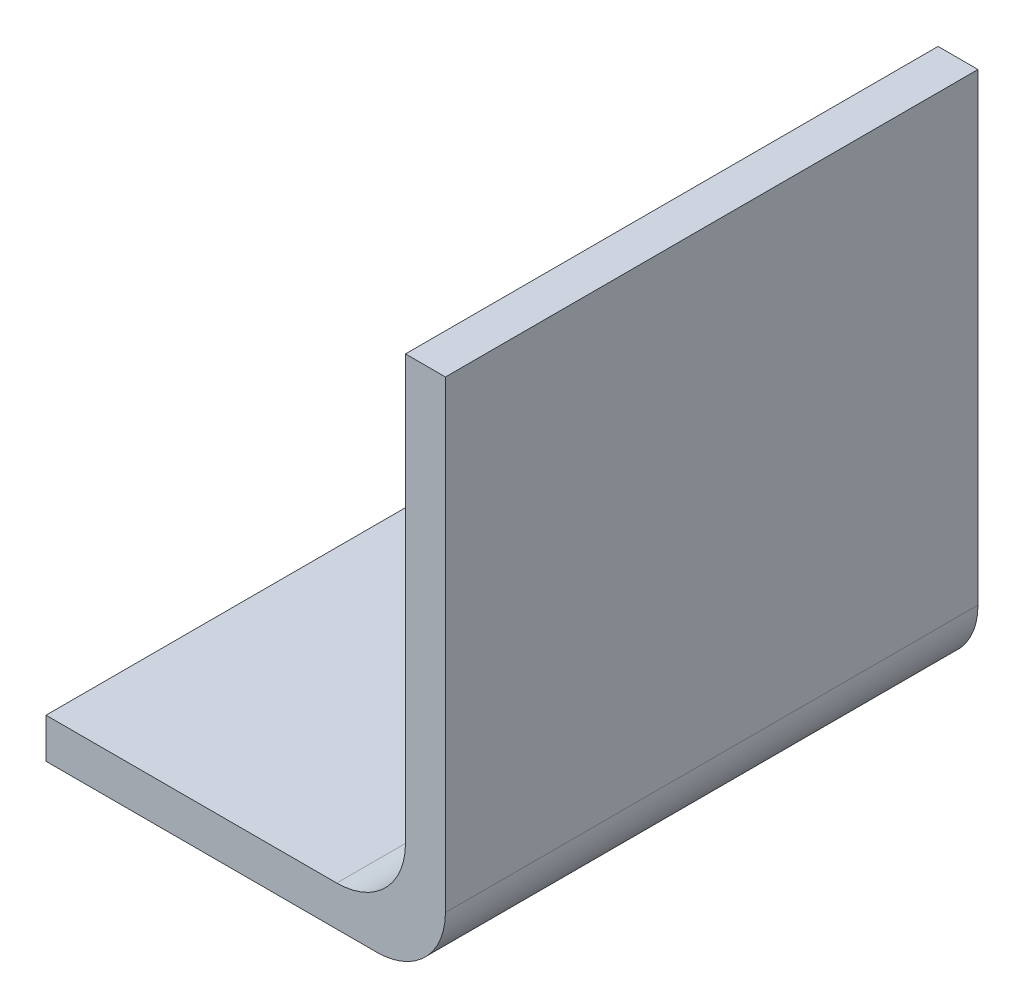
ISO-10303-21;
HEADER;
FILE_DESCRIPTION(('STEP AP214'),'2;1');
FILE_NAME('part.step','',(''),(''),'','','');
FILE_SCHEMA(('AUTOMOTIVE_DESIGN { 1 0 10303 214 1 1 1 1 }'));
ENDSEC;
DATA;
#1=APPLICATION_CONTEXT('core data for automotive mechanical design processes');
#2=APPLICATION_PROTOCOL_DEFINITION('international standard','automotive_design',2000,#1);
#3=PRODUCT_CONTEXT('',#1,'mechanical');
#4=PRODUCT('Part','Part','',(#3));
#5=PRODUCT_RELATED_PRODUCT_CATEGORY('part','',(#4));
#6=PRODUCT_DEFINITION_FORMATION('','',#4);
#7=PRODUCT_DEFINITION_CONTEXT('part definition',#1,'design');
#8=PRODUCT_DEFINITION('design','',#6,#7);
#9=PRODUCT_DEFINITION_SHAPE('','',#8);
#10=(LENGTH_UNIT() NAMED_UNIT(*) SI_UNIT(.MILLI.,.METRE.));
#11=(NAMED_UNIT(*) PLANE_ANGLE_UNIT() SI_UNIT($,.RADIAN.));
#12=(NAMED_UNIT(*) SI_UNIT($,.STERADIAN.) SOLID_ANGLE_UNIT());
#13=UNCERTAINTY_MEASURE_WITH_UNIT(LENGTH_MEASURE(1.E-05),#10,'distance_accuracy_value','');
#14=(GEOMETRIC_REPRESENTATION_CONTEXT(3) GLOBAL_UNCERTAINTY_ASSIGNED_CONTEXT((#13)) GLOBAL_UNIT_ASSIGNED_CONTEXT((#10,
#11,#12)) REPRESENTATION_CONTEXT('',''));
#15=CARTESIAN_POINT('',(0.,0.,0.));
#16=DIRECTION('',(0.,0.,1.));
#17=DIRECTION('',(1.,0.,0.));
#18=AXIS2_PLACEMENT_3D('',#15,#16,#17);
#19=CARTESIAN_POINT('',(0.,3.,40.));
#20=DIRECTION('',(1.,0.,0.));
#21=DIRECTION('',(0.,1.,0.));
#22=AXIS2_PLACEMENT_3D('',#19,#20,#21);
#23=PLANE('',#22);
#24=DIRECTION('',(0.,-1.,0.));
#25=VECTOR('',#24,1.);
#26=CARTESIAN_POINT('',(0.,3.,0.));
#27=LINE('',#26,#25);
#28=CARTESIAN_POINT('',(0.,3.,0.));
#29=VERTEX_POINT('',#28);
#30=CARTESIAN_POINT('',(0.,0.,0.));
#31=VERTEX_POINT('',#30);
#32=EDGE_CURVE('E131',#29,#31,#27,.T.);
#33=ORIENTED_EDGE('',*,*,#32,.T.);
#34=DIRECTION('',(0.,0.,-1.));
#35=VECTOR('',#34,1.);
#36=CARTESIAN_POINT('',(0.,0.,40.));
#37=LINE('',#36,#35);
#38=CARTESIAN_POINT('',(0.,0.,40.));
#39=VERTEX_POINT('',#38);
#40=EDGE_CURVE('E11',#39,#31,#37,.T.);
#41=ORIENTED_EDGE('',*,*,#40,.F.);
#42=DIRECTION('',(0.,-1.,0.));
#43=VECTOR('',#42,1.);
#44=CARTESIAN_POINT('',(0.,3.,40.));
#45=LINE('',#44,#43);
#46=CARTESIAN_POINT('',(0.,3.,40.));
#47=VERTEX_POINT('',#46);
#48=EDGE_CURVE('E146',#47,#39,#45,.T.);
#49=ORIENTED_EDGE('',*,*,#48,.F.);
#50=DIRECTION('',(0.,0.,-1.));
#51=VECTOR('',#50,1.);
#52=CARTESIAN_POINT('',(0.,3.,40.));
#53=LINE('',#52,#51);
#54=EDGE_CURVE('E127',#47,#29,#53,.T.);
#55=ORIENTED_EDGE('',*,*,#54,.T.);
#56=EDGE_LOOP('',(#33,#41,#49,#55));
#57=FACE_BOUND('',#56,.T.);
#58=ADVANCED_FACE('F35',(#57),#23,.F.);
#59=CARTESIAN_POINT('',(0.,0.,40.));
#60=DIRECTION('',(0.,1.,0.));
#61=DIRECTION('',(0.,0.,1.));
#62=AXIS2_PLACEMENT_3D('',#59,#60,#61);
#63=PLANE('',#62);
#64=CARTESIAN_POINT('',(14.7097260011682,0.,20.));
#65=DIRECTION('',(0.,1.,0.));
#66=DIRECTION('',(0.,0.,1.));
#67=AXIS2_PLACEMENT_3D('',#64,#65,#66);
#68=CIRCLE('',#67,5.);
#69=CARTESIAN_POINT('',(14.7097260011682,0.,25.));
#70=VERTEX_POINT('',#69);
#71=EDGE_CURVE('E135',#70,#70,#68,.T.);
#72=ORIENTED_EDGE('',*,*,#71,.T.);
#73=EDGE_LOOP('',(#72));
#74=FACE_BOUND('',#73,.T.);
#75=DIRECTION('',(1.,0.,0.));
#76=VECTOR('',#75,1.);
#77=CARTESIAN_POINT('',(0.,0.,0.));
#78=LINE('',#77,#76);
#79=CARTESIAN_POINT('',(24.8368515756481,0.,0.));
#80=VERTEX_POINT('',#79);
#81=EDGE_CURVE('E134',#31,#80,#78,.T.);
#82=ORIENTED_EDGE('',*,*,#81,.T.);
#83=DIRECTION('',(0.,0.,-1.));
#84=VECTOR('',#83,1.);
#85=CARTESIAN_POINT('',(24.8368515756481,0.,40.));
#86=LINE('',#85,#84);
#87=CARTESIAN_POINT('',(24.8368515756481,0.,40.));
#88=VERTEX_POINT('',#87);
#89=EDGE_CURVE('E43',#88,#80,#86,.T.);
#90=ORIENTED_EDGE('',*,*,#89,.F.);
#91=DIRECTION('',(1.,0.,0.));
#92=VECTOR('',#91,1.);
#93=CARTESIAN_POINT('',(0.,0.,40.));
#94=LINE('',#93,#92);
#95=EDGE_CURVE('E94',#39,#88,#94,.T.);
#96=ORIENTED_EDGE('',*,*,#95,.F.);
#97=ORIENTED_EDGE('',*,*,#40,.T.);
#98=EDGE_LOOP('',(#82,#90,#96,#97));
#99=FACE_BOUND('',#98,.T.);
#100=ADVANCED_FACE('F199',(#74,#99),#63,.F.);
#101=CARTESIAN_POINT('',(24.8368515756481,5.16314842435189,40.));
#102=DIRECTION('',(0.,0.,-1.));
#103=DIRECTION('',(-1.,0.,0.));
#104=AXIS2_PLACEMENT_3D('',#101,#102,#103);
#105=CYLINDRICAL_SURFACE('',#104,5.16314842435189);
#106=CARTESIAN_POINT('',(24.8368515756481,5.16314842435189,0.));
#107=DIRECTION('',(0.,0.,1.));
#108=DIRECTION('',(1.,0.,0.));
#109=AXIS2_PLACEMENT_3D('',#106,#107,#108);
#110=CIRCLE('',#109,5.16314842435189);
#111=CARTESIAN_POINT('',(30.,5.16314842435189,0.));
#112=VERTEX_POINT('',#111);
#113=EDGE_CURVE('E137',#80,#112,#110,.T.);
#114=ORIENTED_EDGE('',*,*,#113,.T.);
#115=DIRECTION('',(0.,0.,-1.));
#116=VECTOR('',#115,1.);
#117=CARTESIAN_POINT('',(30.,5.16314842435189,40.));
#118=LINE('',#117,#116);
#119=CARTESIAN_POINT('',(30.,5.16314842435189,40.));
#120=VERTEX_POINT('',#119);
#121=EDGE_CURVE('E153',#120,#112,#118,.T.);
#122=ORIENTED_EDGE('',*,*,#121,.F.);
#123=CARTESIAN_POINT('',(24.8368515756481,5.16314842435189,40.));
#124=DIRECTION('',(0.,0.,1.));
#125=DIRECTION('',(1.,0.,0.));
#126=AXIS2_PLACEMENT_3D('',#123,#124,#125);
#127=CIRCLE('',#126,5.16314842435189);
#128=EDGE_CURVE('E161',#88,#120,#127,.T.);
#129=ORIENTED_EDGE('',*,*,#128,.F.);
#130=ORIENTED_EDGE('',*,*,#89,.T.);
#131=EDGE_LOOP('',(#114,#122,#129,#130));
#132=FACE_BOUND('',#131,.T.);
#133=ADVANCED_FACE('F159',(#132),#105,.T.);
#134=CARTESIAN_POINT('',(30.,5.16314842435189,40.));
#135=DIRECTION('',(-1.,0.,0.));
#136=DIRECTION('',(0.,0.,1.));
#137=AXIS2_PLACEMENT_3D('',#134,#135,#136);
#138=PLANE('',#137);
#139=DIRECTION('',(0.,1.,0.));
#140=VECTOR('',#139,1.);
#141=CARTESIAN_POINT('',(30.,5.16314842435189,0.));
#142=LINE('',#141,#140);
#143=CARTESIAN_POINT('',(30.,40.,0.));
#144=VERTEX_POINT('',#143);
#145=EDGE_CURVE('E139',#112,#144,#142,.T.);
#146=ORIENTED_EDGE('',*,*,#145,.T.);
#147=DIRECTION('',(0.,0.,-1.));
#148=VECTOR('',#147,1.);
#149=CARTESIAN_POINT('',(30.,40.,40.));
#150=LINE('',#149,#148);
#151=CARTESIAN_POINT('',(30.,40.,40.));
#152=VERTEX_POINT('',#151);
#153=EDGE_CURVE('E150',#152,#144,#150,.T.);
#154=ORIENTED_EDGE('',*,*,#153,.F.);
#155=DIRECTION('',(0.,1.,0.));
#156=VECTOR('',#155,1.);
#157=CARTESIAN_POINT('',(30.,5.16314842435189,40.));
#158=LINE('',#157,#156);
#159=EDGE_CURVE('E173',#120,#152,#158,.T.);
#160=ORIENTED_EDGE('',*,*,#159,.F.);
#161=ORIENTED_EDGE('',*,*,#121,.T.);
#162=EDGE_LOOP('',(#146,#154,#160,#161));
#163=FACE_BOUND('',#162,.T.);
#164=ADVANCED_FACE('F169',(#163),#138,.F.);
#165=CARTESIAN_POINT('',(30.,40.,40.));
#166=DIRECTION('',(0.,-1.,0.));
#167=DIRECTION('',(0.,0.,-1.));
#168=AXIS2_PLACEMENT_3D('',#165,#166,#167);
#169=PLANE('',#168);
#170=DIRECTION('',(-1.,0.,0.));
#171=VECTOR('',#170,1.);
#172=CARTESIAN_POINT('',(30.,40.,0.));
#173=LINE('',#172,#171);
#174=CARTESIAN_POINT('',(27.,40.,0.));
#175=VERTEX_POINT('',#174);
#176=EDGE_CURVE('E141',#144,#175,#173,.T.);
#177=ORIENTED_EDGE('',*,*,#176,.T.);
#178=DIRECTION('',(0.,0.,-1.));
#179=VECTOR('',#178,1.);
#180=CARTESIAN_POINT('',(27.,40.,40.));
#181=LINE('',#180,#179);
#182=CARTESIAN_POINT('',(27.,40.,40.));
#183=VERTEX_POINT('',#182);
#184=EDGE_CURVE('E122',#183,#175,#181,.T.);
#185=ORIENTED_EDGE('',*,*,#184,.F.);
#186=DIRECTION('',(-1.,0.,0.));
#187=VECTOR('',#186,1.);
#188=CARTESIAN_POINT('',(30.,40.,40.));
#189=LINE('',#188,#187);
#190=EDGE_CURVE('E113',#152,#183,#189,.T.);
#191=ORIENTED_EDGE('',*,*,#190,.F.);
#192=ORIENTED_EDGE('',*,*,#153,.T.);
#193=EDGE_LOOP('',(#177,#185,#191,#192));
#194=FACE_BOUND('',#193,.T.);
#195=ADVANCED_FACE('F172',(#194),#169,.F.);
#196=CARTESIAN_POINT('',(27.,40.,40.));
#197=DIRECTION('',(1.,0.,0.));
#198=DIRECTION('',(0.,1.,0.));
#199=AXIS2_PLACEMENT_3D('',#196,#197,#198);
#200=PLANE('',#199);
#201=DIRECTION('',(0.,-1.,0.));
#202=VECTOR('',#201,1.);
#203=CARTESIAN_POINT('',(27.,40.,0.));
#204=LINE('',#203,#202);
#205=CARTESIAN_POINT('',(27.,8.1631484243519,0.));
#206=VERTEX_POINT('',#205);
#207=EDGE_CURVE('E121',#175,#206,#204,.T.);
#208=ORIENTED_EDGE('',*,*,#207,.T.);
#209=DIRECTION('',(0.,0.,-1.));
#210=VECTOR('',#209,1.);
#211=CARTESIAN_POINT('',(27.,8.1631484243519,40.));
#212=LINE('',#211,#210);
#213=CARTESIAN_POINT('',(27.,8.1631484243519,40.));
#214=VERTEX_POINT('',#213);
#215=EDGE_CURVE('E118',#214,#206,#212,.T.);
#216=ORIENTED_EDGE('',*,*,#215,.F.);
#217=DIRECTION('',(0.,-1.,0.));
#218=VECTOR('',#217,1.);
#219=CARTESIAN_POINT('',(27.,40.,40.));
#220=LINE('',#219,#218);
#221=EDGE_CURVE('E107',#183,#214,#220,.T.);
#222=ORIENTED_EDGE('',*,*,#221,.F.);
#223=ORIENTED_EDGE('',*,*,#184,.T.);
#224=EDGE_LOOP('',(#208,#216,#222,#223));
#225=FACE_BOUND('',#224,.T.);
#226=ADVANCED_FACE('F119',(#225),#200,.F.);
#227=CARTESIAN_POINT('',(21.8368515756481,8.1631484243519,40.));
#228=DIRECTION('',(0.,0.,-1.));
#229=DIRECTION('',(-1.,0.,0.));
#230=AXIS2_PLACEMENT_3D('',#227,#228,#229);
#231=CYLINDRICAL_SURFACE('',#230,5.16314842435189);
#232=CARTESIAN_POINT('',(21.8368515756481,8.1631484243519,0.));
#233=DIRECTION('',(0.,0.,-1.));
#234=DIRECTION('',(-1.,0.,0.));
#235=AXIS2_PLACEMENT_3D('',#232,#233,#234);
#236=CIRCLE('',#235,5.16314842435189);
#237=CARTESIAN_POINT('',(21.8368515756481,3.,0.));
#238=VERTEX_POINT('',#237);
#239=EDGE_CURVE('E80',#206,#238,#236,.T.);
#240=ORIENTED_EDGE('',*,*,#239,.T.);
#241=DIRECTION('',(0.,0.,-1.));
#242=VECTOR('',#241,1.);
#243=CARTESIAN_POINT('',(21.8368515756481,3.,40.));
#244=LINE('',#243,#242);
#245=CARTESIAN_POINT('',(21.8368515756481,3.,40.));
#246=VERTEX_POINT('',#245);
#247=EDGE_CURVE('E123',#246,#238,#244,.T.);
#248=ORIENTED_EDGE('',*,*,#247,.F.);
#249=CARTESIAN_POINT('',(21.8368515756481,8.1631484243519,40.));
#250=DIRECTION('',(0.,0.,-1.));
#251=DIRECTION('',(-1.,0.,0.));
#252=AXIS2_PLACEMENT_3D('',#249,#250,#251);
#253=CIRCLE('',#252,5.16314842435189);
#254=EDGE_CURVE('E111',#214,#246,#253,.T.);
#255=ORIENTED_EDGE('',*,*,#254,.F.);
#256=ORIENTED_EDGE('',*,*,#215,.T.);
#257=EDGE_LOOP('',(#240,#248,#255,#256));
#258=FACE_BOUND('',#257,.T.);
#259=ADVANCED_FACE('F125',(#258),#231,.F.);
#260=CARTESIAN_POINT('',(21.8368515756481,3.,40.));
#261=DIRECTION('',(0.,-1.,0.));
#262=DIRECTION('',(1.,0.,0.));
#263=AXIS2_PLACEMENT_3D('',#260,#261,#262);
#264=PLANE('',#263);
#265=CARTESIAN_POINT('',(14.7097260011682,3.,20.));
#266=DIRECTION('',(0.,1.,0.));
#267=DIRECTION('',(-1.,0.,0.));
#268=AXIS2_PLACEMENT_3D('',#265,#266,#267);
#269=CIRCLE('',#268,5.);
#270=CARTESIAN_POINT('',(9.70972600116815,3.,20.));
#271=VERTEX_POINT('',#270);
#272=EDGE_CURVE('E181',#271,#271,#269,.T.);
#273=ORIENTED_EDGE('',*,*,#272,.F.);
#274=EDGE_LOOP('',(#273));
#275=FACE_BOUND('',#274,.T.);
#276=DIRECTION('',(-1.,0.,0.));
#277=VECTOR('',#276,1.);
#278=CARTESIAN_POINT('',(21.8368515756481,3.,0.));
#279=LINE('',#278,#277);
#280=EDGE_CURVE('E86',#238,#29,#279,.T.);
#281=ORIENTED_EDGE('',*,*,#280,.T.);
#282=ORIENTED_EDGE('',*,*,#54,.F.);
#283=DIRECTION('',(-1.,0.,0.));
#284=VECTOR('',#283,1.);
#285=CARTESIAN_POINT('',(21.8368515756481,3.,40.));
#286=LINE('',#285,#284);
#287=EDGE_CURVE('E51',#246,#47,#286,.T.);
#288=ORIENTED_EDGE('',*,*,#287,.F.);
#289=ORIENTED_EDGE('',*,*,#247,.T.);
#290=EDGE_LOOP('',(#281,#282,#288,#289));
#291=FACE_BOUND('',#290,.T.);
#292=ADVANCED_FACE('F188',(#275,#291),#264,.F.);
#293=CARTESIAN_POINT('',(24.8368515756481,5.16314842435189,40.));
#294=DIRECTION('',(0.,0.,1.));
#295=DIRECTION('',(1.,0.,0.));
#296=AXIS2_PLACEMENT_3D('',#293,#294,#295);
#297=PLANE('',#296);
#298=ORIENTED_EDGE('',*,*,#48,.T.);
#299=ORIENTED_EDGE('',*,*,#95,.T.);
#300=ORIENTED_EDGE('',*,*,#128,.T.);
#301=ORIENTED_EDGE('',*,*,#159,.T.);
#302=ORIENTED_EDGE('',*,*,#190,.T.);
#303=ORIENTED_EDGE('',*,*,#221,.T.);
#304=ORIENTED_EDGE('',*,*,#254,.T.);
#305=ORIENTED_EDGE('',*,*,#287,.T.);
#306=EDGE_LOOP('',(#298,#299,#300,#301,#302,#303,#304,#305));
#307=FACE_BOUND('',#306,.T.);
#308=ADVANCED_FACE('F109',(#307),#297,.T.);
#309=CARTESIAN_POINT('',(24.8368515756481,5.16314842435189,0.));
#310=DIRECTION('',(0.,0.,1.));
#311=DIRECTION('',(1.,0.,0.));
#312=AXIS2_PLACEMENT_3D('',#309,#310,#311);
#313=PLANE('',#312);
#314=ORIENTED_EDGE('',*,*,#32,.F.);
#315=ORIENTED_EDGE('',*,*,#280,.F.);
#316=ORIENTED_EDGE('',*,*,#239,.F.);
#317=ORIENTED_EDGE('',*,*,#207,.F.);
#318=ORIENTED_EDGE('',*,*,#176,.F.);
#319=ORIENTED_EDGE('',*,*,#145,.F.);
#320=ORIENTED_EDGE('',*,*,#113,.F.);
#321=ORIENTED_EDGE('',*,*,#81,.F.);
#322=EDGE_LOOP('',(#314,#315,#316,#317,#318,#319,#320,#321));
#323=FACE_BOUND('',#322,.T.);
#324=ADVANCED_FACE('F165',(#323),#313,.F.);
#325=CARTESIAN_POINT('',(14.7097260011682,-37.,20.));
#326=DIRECTION('',(0.,1.,0.));
#327=DIRECTION('',(-1.,0.,0.));
#328=AXIS2_PLACEMENT_3D('',#325,#326,#327);
#329=CYLINDRICAL_SURFACE('',#328,5.);
#330=ORIENTED_EDGE('',*,*,#272,.T.);
#331=EDGE_LOOP('',(#330));
#332=FACE_BOUND('',#331,.T.);
#333=ORIENTED_EDGE('',*,*,#71,.F.);
#334=EDGE_LOOP('',(#333));
#335=FACE_BOUND('',#334,.T.);
#336=ADVANCED_FACE('F185',(#332,#335),#329,.F.);
#337=CLOSED_SHELL('',(#58,#100,#133,#164,#195,#226,#259,#292,#308,#324,#336));
#338=MANIFOLD_SOLID_BREP('B2',#337);
#339=ADVANCED_BREP_SHAPE_REPRESENTATION('',(#18,#338),#14);
#340=SHAPE_DEFINITION_REPRESENTATION(#9,#339);
ENDSEC;
END-ISO-10303-21;
